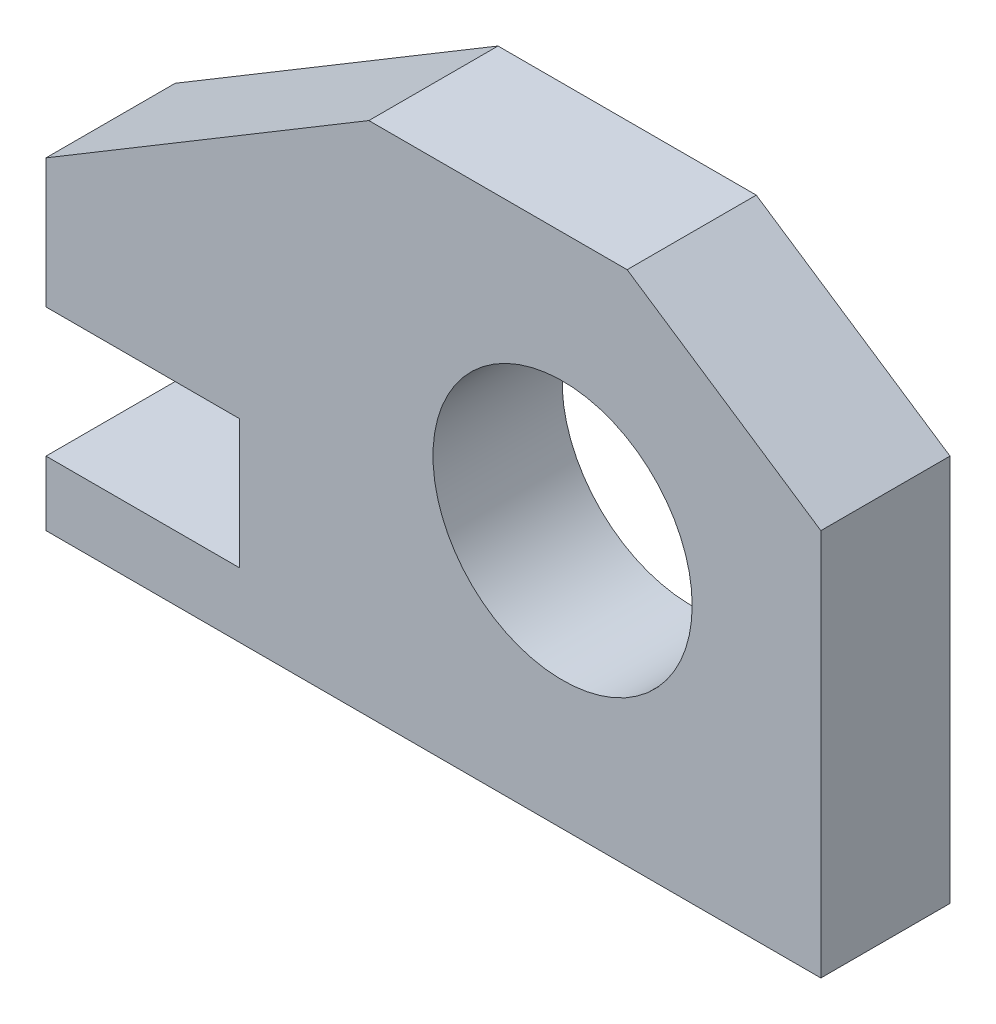
ISO-10303-21;
HEADER;
FILE_DESCRIPTION(('STEP AP214'),'2;1');
FILE_NAME('part.step','',(''),(''),'','','');
FILE_SCHEMA(('AUTOMOTIVE_DESIGN { 1 0 10303 214 1 1 1 1 }'));
ENDSEC;
DATA;
#1=APPLICATION_CONTEXT('core data for automotive mechanical design processes');
#2=APPLICATION_PROTOCOL_DEFINITION('international standard','automotive_design',2000,#1);
#3=PRODUCT_CONTEXT('',#1,'mechanical');
#4=PRODUCT('Part','Part','',(#3));
#5=PRODUCT_RELATED_PRODUCT_CATEGORY('part','',(#4));
#6=PRODUCT_DEFINITION_FORMATION('','',#4);
#7=PRODUCT_DEFINITION_CONTEXT('part definition',#1,'design');
#8=PRODUCT_DEFINITION('design','',#6,#7);
#9=PRODUCT_DEFINITION_SHAPE('','',#8);
#10=(LENGTH_UNIT() NAMED_UNIT(*) SI_UNIT(.MILLI.,.METRE.));
#11=(NAMED_UNIT(*) PLANE_ANGLE_UNIT() SI_UNIT($,.RADIAN.));
#12=(NAMED_UNIT(*) SI_UNIT($,.STERADIAN.) SOLID_ANGLE_UNIT());
#13=UNCERTAINTY_MEASURE_WITH_UNIT(LENGTH_MEASURE(1.E-05),#10,'distance_accuracy_value','');
#14=(GEOMETRIC_REPRESENTATION_CONTEXT(3) GLOBAL_UNCERTAINTY_ASSIGNED_CONTEXT((#13)) GLOBAL_UNIT_ASSIGNED_CONTEXT((#10,
#11,#12)) REPRESENTATION_CONTEXT('',''));
#15=CARTESIAN_POINT('',(0.,0.,0.));
#16=DIRECTION('',(0.,0.,1.));
#17=DIRECTION('',(1.,0.,0.));
#18=AXIS2_PLACEMENT_3D('',#15,#16,#17);
#19=CARTESIAN_POINT('',(-149.660784313726,43.3294117647059,12.7));
#20=DIRECTION('',(-0.514495755427526,0.857492925712544,0.));
#21=DIRECTION('',(-0.857492925712544,-0.514495755427526,0.));
#22=AXIS2_PLACEMENT_3D('',#19,#20,#21);
#23=PLANE('',#22);
#24=DIRECTION('',(0.857492925712544,0.514495755427526,0.));
#25=VECTOR('',#24,1.);
#26=CARTESIAN_POINT('',(-149.660784313726,43.3294117647059,0.));
#27=LINE('',#26,#25);
#28=CARTESIAN_POINT('',(-149.660784313726,43.3294117647059,0.));
#29=VERTEX_POINT('',#28);
#30=CARTESIAN_POINT('',(-117.910784313726,62.3794117647059,0.));
#31=VERTEX_POINT('',#30);
#32=EDGE_CURVE('E155',#29,#31,#27,.T.);
#33=ORIENTED_EDGE('',*,*,#32,.F.);
#34=DIRECTION('',(0.,0.,-1.));
#35=VECTOR('',#34,1.);
#36=CARTESIAN_POINT('',(-149.660784313726,43.3294117647059,12.7));
#37=LINE('',#36,#35);
#38=CARTESIAN_POINT('',(-149.660784313726,43.3294117647059,12.7));
#39=VERTEX_POINT('',#38);
#40=EDGE_CURVE('E11',#39,#29,#37,.T.);
#41=ORIENTED_EDGE('',*,*,#40,.F.);
#42=DIRECTION('',(0.857492925712544,0.514495755427526,0.));
#43=VECTOR('',#42,1.);
#44=CARTESIAN_POINT('',(-149.660784313726,43.3294117647059,12.7));
#45=LINE('',#44,#43);
#46=CARTESIAN_POINT('',(-117.910784313726,62.3794117647059,12.7));
#47=VERTEX_POINT('',#46);
#48=EDGE_CURVE('E191',#39,#47,#45,.T.);
#49=ORIENTED_EDGE('',*,*,#48,.T.);
#50=DIRECTION('',(0.,0.,-1.));
#51=VECTOR('',#50,1.);
#52=CARTESIAN_POINT('',(-117.910784313726,62.3794117647059,12.7));
#53=LINE('',#52,#51);
#54=EDGE_CURVE('E42',#47,#31,#53,.T.);
#55=ORIENTED_EDGE('',*,*,#54,.T.);
#56=EDGE_LOOP('',(#33,#41,#49,#55));
#57=FACE_BOUND('',#56,.T.);
#58=ADVANCED_FACE('F39',(#57),#23,.T.);
#59=CARTESIAN_POINT('',(-149.660784313726,43.3294117647059,12.7));
#60=DIRECTION('',(1.,0.,0.));
#61=DIRECTION('',(0.,0.,-1.));
#62=AXIS2_PLACEMENT_3D('',#59,#60,#61);
#63=PLANE('',#62);
#64=DIRECTION('',(0.,-1.,0.));
#65=VECTOR('',#64,1.);
#66=CARTESIAN_POINT('',(-149.660784313726,43.3294117647059,0.));
#67=LINE('',#66,#65);
#68=CARTESIAN_POINT('',(-149.660784313726,30.6294117647059,0.));
#69=VERTEX_POINT('',#68);
#70=EDGE_CURVE('E189',#29,#69,#67,.T.);
#71=ORIENTED_EDGE('',*,*,#70,.T.);
#72=DIRECTION('',(0.,0.,-1.));
#73=VECTOR('',#72,1.);
#74=CARTESIAN_POINT('',(-149.660784313726,30.6294117647059,12.7));
#75=LINE('',#74,#73);
#76=CARTESIAN_POINT('',(-149.660784313726,30.6294117647059,12.7));
#77=VERTEX_POINT('',#76);
#78=EDGE_CURVE('E49',#77,#69,#75,.T.);
#79=ORIENTED_EDGE('',*,*,#78,.F.);
#80=DIRECTION('',(0.,-1.,0.));
#81=VECTOR('',#80,1.);
#82=CARTESIAN_POINT('',(-149.660784313726,43.3294117647059,12.7));
#83=LINE('',#82,#81);
#84=EDGE_CURVE('E141',#39,#77,#83,.T.);
#85=ORIENTED_EDGE('',*,*,#84,.F.);
#86=ORIENTED_EDGE('',*,*,#40,.T.);
#87=EDGE_LOOP('',(#71,#79,#85,#86));
#88=FACE_BOUND('',#87,.T.);
#89=ADVANCED_FACE('F215',(#88),#63,.F.);
#90=CARTESIAN_POINT('',(-130.610784313726,30.6294117647059,12.7));
#91=DIRECTION('',(0.,-1.,0.));
#92=DIRECTION('',(0.,0.,-1.));
#93=AXIS2_PLACEMENT_3D('',#90,#91,#92);
#94=PLANE('',#93);
#95=DIRECTION('',(-1.,0.,0.));
#96=VECTOR('',#95,1.);
#97=CARTESIAN_POINT('',(-130.610784313726,30.6294117647059,0.));
#98=LINE('',#97,#96);
#99=CARTESIAN_POINT('',(-130.610784313726,30.6294117647059,0.));
#100=VERTEX_POINT('',#99);
#101=EDGE_CURVE('E126',#100,#69,#98,.T.);
#102=ORIENTED_EDGE('',*,*,#101,.F.);
#103=DIRECTION('',(0.,0.,-1.));
#104=VECTOR('',#103,1.);
#105=CARTESIAN_POINT('',(-130.610784313726,30.6294117647059,12.7));
#106=LINE('',#105,#104);
#107=CARTESIAN_POINT('',(-130.610784313726,30.6294117647059,12.7));
#108=VERTEX_POINT('',#107);
#109=EDGE_CURVE('E121',#108,#100,#106,.T.);
#110=ORIENTED_EDGE('',*,*,#109,.F.);
#111=DIRECTION('',(-1.,0.,0.));
#112=VECTOR('',#111,1.);
#113=CARTESIAN_POINT('',(-130.610784313726,30.6294117647059,12.7));
#114=LINE('',#113,#112);
#115=EDGE_CURVE('E124',#108,#77,#114,.T.);
#116=ORIENTED_EDGE('',*,*,#115,.T.);
#117=ORIENTED_EDGE('',*,*,#78,.T.);
#118=EDGE_LOOP('',(#102,#110,#116,#117));
#119=FACE_BOUND('',#118,.T.);
#120=ADVANCED_FACE('F123',(#119),#94,.T.);
#121=CARTESIAN_POINT('',(-130.610784313726,17.9294117647059,12.7));
#122=DIRECTION('',(-1.,0.,0.));
#123=DIRECTION('',(0.,0.,1.));
#124=AXIS2_PLACEMENT_3D('',#121,#122,#123);
#125=PLANE('',#124);
#126=DIRECTION('',(0.,1.,0.));
#127=VECTOR('',#126,1.);
#128=CARTESIAN_POINT('',(-130.610784313726,17.9294117647059,0.));
#129=LINE('',#128,#127);
#130=CARTESIAN_POINT('',(-130.610784313726,17.9294117647059,0.));
#131=VERTEX_POINT('',#130);
#132=EDGE_CURVE('E184',#131,#100,#129,.T.);
#133=ORIENTED_EDGE('',*,*,#132,.F.);
#134=DIRECTION('',(0.,0.,-1.));
#135=VECTOR('',#134,1.);
#136=CARTESIAN_POINT('',(-130.610784313726,17.9294117647059,12.7));
#137=LINE('',#136,#135);
#138=CARTESIAN_POINT('',(-130.610784313726,17.9294117647059,12.7));
#139=VERTEX_POINT('',#138);
#140=EDGE_CURVE('E132',#139,#131,#137,.T.);
#141=ORIENTED_EDGE('',*,*,#140,.F.);
#142=DIRECTION('',(0.,1.,0.));
#143=VECTOR('',#142,1.);
#144=CARTESIAN_POINT('',(-130.610784313726,17.9294117647059,12.7));
#145=LINE('',#144,#143);
#146=EDGE_CURVE('E139',#139,#108,#145,.T.);
#147=ORIENTED_EDGE('',*,*,#146,.T.);
#148=ORIENTED_EDGE('',*,*,#109,.T.);
#149=EDGE_LOOP('',(#133,#141,#147,#148));
#150=FACE_BOUND('',#149,.T.);
#151=ADVANCED_FACE('F144',(#150),#125,.T.);
#152=CARTESIAN_POINT('',(-149.660784313726,17.9294117647059,12.7));
#153=DIRECTION('',(0.,1.,0.));
#154=DIRECTION('',(0.,0.,1.));
#155=AXIS2_PLACEMENT_3D('',#152,#153,#154);
#156=PLANE('',#155);
#157=DIRECTION('',(1.,0.,0.));
#158=VECTOR('',#157,1.);
#159=CARTESIAN_POINT('',(-149.660784313726,17.9294117647059,0.));
#160=LINE('',#159,#158);
#161=CARTESIAN_POINT('',(-149.660784313726,17.9294117647059,0.));
#162=VERTEX_POINT('',#161);
#163=EDGE_CURVE('E180',#162,#131,#160,.T.);
#164=ORIENTED_EDGE('',*,*,#163,.F.);
#165=DIRECTION('',(0.,0.,-1.));
#166=VECTOR('',#165,1.);
#167=CARTESIAN_POINT('',(-149.660784313726,17.9294117647059,12.7));
#168=LINE('',#167,#166);
#169=CARTESIAN_POINT('',(-149.660784313726,17.9294117647059,12.7));
#170=VERTEX_POINT('',#169);
#171=EDGE_CURVE('E197',#170,#162,#168,.T.);
#172=ORIENTED_EDGE('',*,*,#171,.F.);
#173=DIRECTION('',(1.,0.,0.));
#174=VECTOR('',#173,1.);
#175=CARTESIAN_POINT('',(-149.660784313726,17.9294117647059,12.7));
#176=LINE('',#175,#174);
#177=EDGE_CURVE('E146',#170,#139,#176,.T.);
#178=ORIENTED_EDGE('',*,*,#177,.T.);
#179=ORIENTED_EDGE('',*,*,#140,.T.);
#180=EDGE_LOOP('',(#164,#172,#178,#179));
#181=FACE_BOUND('',#180,.T.);
#182=ADVANCED_FACE('F255',(#181),#156,.T.);
#183=CARTESIAN_POINT('',(-149.660784313726,11.5794117647059,12.7));
#184=DIRECTION('',(-1.,0.,0.));
#185=DIRECTION('',(0.,0.,1.));
#186=AXIS2_PLACEMENT_3D('',#183,#184,#185);
#187=PLANE('',#186);
#188=DIRECTION('',(0.,1.,0.));
#189=VECTOR('',#188,1.);
#190=CARTESIAN_POINT('',(-149.660784313726,11.5794117647059,0.));
#191=LINE('',#190,#189);
#192=CARTESIAN_POINT('',(-149.660784313726,11.5794117647059,0.));
#193=VERTEX_POINT('',#192);
#194=EDGE_CURVE('E176',#193,#162,#191,.T.);
#195=ORIENTED_EDGE('',*,*,#194,.F.);
#196=DIRECTION('',(0.,0.,-1.));
#197=VECTOR('',#196,1.);
#198=CARTESIAN_POINT('',(-149.660784313726,11.5794117647059,12.7));
#199=LINE('',#198,#197);
#200=CARTESIAN_POINT('',(-149.660784313726,11.5794117647059,12.7));
#201=VERTEX_POINT('',#200);
#202=EDGE_CURVE('E200',#201,#193,#199,.T.);
#203=ORIENTED_EDGE('',*,*,#202,.F.);
#204=DIRECTION('',(0.,1.,0.));
#205=VECTOR('',#204,1.);
#206=CARTESIAN_POINT('',(-149.660784313726,11.5794117647059,12.7));
#207=LINE('',#206,#205);
#208=EDGE_CURVE('E149',#201,#170,#207,.T.);
#209=ORIENTED_EDGE('',*,*,#208,.T.);
#210=ORIENTED_EDGE('',*,*,#171,.T.);
#211=EDGE_LOOP('',(#195,#203,#209,#210));
#212=FACE_BOUND('',#211,.T.);
#213=ADVANCED_FACE('F242',(#212),#187,.T.);
#214=CARTESIAN_POINT('',(-73.4607843137255,11.5794117647059,12.7));
#215=DIRECTION('',(0.,-1.,0.));
#216=DIRECTION('',(1.,0.,0.));
#217=AXIS2_PLACEMENT_3D('',#214,#215,#216);
#218=PLANE('',#217);
#219=DIRECTION('',(-1.,0.,0.));
#220=VECTOR('',#219,1.);
#221=CARTESIAN_POINT('',(-73.4607843137255,11.5794117647059,0.));
#222=LINE('',#221,#220);
#223=CARTESIAN_POINT('',(-73.4607843137255,11.5794117647059,0.));
#224=VERTEX_POINT('',#223);
#225=EDGE_CURVE('E172',#224,#193,#222,.T.);
#226=ORIENTED_EDGE('',*,*,#225,.F.);
#227=DIRECTION('',(0.,0.,-1.));
#228=VECTOR('',#227,1.);
#229=CARTESIAN_POINT('',(-73.4607843137255,11.5794117647059,12.7));
#230=LINE('',#229,#228);
#231=CARTESIAN_POINT('',(-73.4607843137255,11.5794117647059,12.7));
#232=VERTEX_POINT('',#231);
#233=EDGE_CURVE('E203',#232,#224,#230,.T.);
#234=ORIENTED_EDGE('',*,*,#233,.F.);
#235=DIRECTION('',(-1.,0.,0.));
#236=VECTOR('',#235,1.);
#237=CARTESIAN_POINT('',(-73.4607843137255,11.5794117647059,12.7));
#238=LINE('',#237,#236);
#239=EDGE_CURVE('E234',#232,#201,#238,.T.);
#240=ORIENTED_EDGE('',*,*,#239,.T.);
#241=ORIENTED_EDGE('',*,*,#202,.T.);
#242=EDGE_LOOP('',(#226,#234,#240,#241));
#243=FACE_BOUND('',#242,.T.);
#244=ADVANCED_FACE('F248',(#243),#218,.T.);
#245=CARTESIAN_POINT('',(-73.4607843137255,49.6794117647059,12.7));
#246=DIRECTION('',(1.,0.,0.));
#247=DIRECTION('',(0.,1.,0.));
#248=AXIS2_PLACEMENT_3D('',#245,#246,#247);
#249=PLANE('',#248);
#250=DIRECTION('',(0.,-1.,0.));
#251=VECTOR('',#250,1.);
#252=CARTESIAN_POINT('',(-73.4607843137255,49.6794117647059,0.));
#253=LINE('',#252,#251);
#254=CARTESIAN_POINT('',(-73.4607843137255,49.6794117647059,0.));
#255=VERTEX_POINT('',#254);
#256=EDGE_CURVE('E168',#255,#224,#253,.T.);
#257=ORIENTED_EDGE('',*,*,#256,.F.);
#258=DIRECTION('',(0.,0.,-1.));
#259=VECTOR('',#258,1.);
#260=CARTESIAN_POINT('',(-73.4607843137255,49.6794117647059,12.7));
#261=LINE('',#260,#259);
#262=CARTESIAN_POINT('',(-73.4607843137255,49.6794117647059,12.7));
#263=VERTEX_POINT('',#262);
#264=EDGE_CURVE('E206',#263,#255,#261,.T.);
#265=ORIENTED_EDGE('',*,*,#264,.F.);
#266=DIRECTION('',(0.,-1.,0.));
#267=VECTOR('',#266,1.);
#268=CARTESIAN_POINT('',(-73.4607843137255,49.6794117647059,12.7));
#269=LINE('',#268,#267);
#270=EDGE_CURVE('E230',#263,#232,#269,.T.);
#271=ORIENTED_EDGE('',*,*,#270,.T.);
#272=ORIENTED_EDGE('',*,*,#233,.T.);
#273=EDGE_LOOP('',(#257,#265,#271,#272));
#274=FACE_BOUND('',#273,.T.);
#275=ADVANCED_FACE('F251',(#274),#249,.T.);
#276=CARTESIAN_POINT('',(-92.5107843137255,62.3794117647059,12.7));
#277=DIRECTION('',(0.554700196225229,0.832050294337844,0.));
#278=DIRECTION('',(-0.832050294337844,0.554700196225229,0.));
#279=AXIS2_PLACEMENT_3D('',#276,#277,#278);
#280=PLANE('',#279);
#281=DIRECTION('',(0.832050294337844,-0.554700196225229,0.));
#282=VECTOR('',#281,1.);
#283=CARTESIAN_POINT('',(-92.5107843137255,62.3794117647059,0.));
#284=LINE('',#283,#282);
#285=CARTESIAN_POINT('',(-92.5107843137255,62.3794117647059,0.));
#286=VERTEX_POINT('',#285);
#287=EDGE_CURVE('E164',#286,#255,#284,.T.);
#288=ORIENTED_EDGE('',*,*,#287,.F.);
#289=DIRECTION('',(0.,0.,-1.));
#290=VECTOR('',#289,1.);
#291=CARTESIAN_POINT('',(-92.5107843137255,62.3794117647059,12.7));
#292=LINE('',#291,#290);
#293=CARTESIAN_POINT('',(-92.5107843137255,62.3794117647059,12.7));
#294=VERTEX_POINT('',#293);
#295=EDGE_CURVE('E208',#294,#286,#292,.T.);
#296=ORIENTED_EDGE('',*,*,#295,.F.);
#297=DIRECTION('',(0.832050294337844,-0.554700196225229,0.));
#298=VECTOR('',#297,1.);
#299=CARTESIAN_POINT('',(-92.5107843137255,62.3794117647059,12.7));
#300=LINE('',#299,#298);
#301=EDGE_CURVE('E221',#294,#263,#300,.T.);
#302=ORIENTED_EDGE('',*,*,#301,.T.);
#303=ORIENTED_EDGE('',*,*,#264,.T.);
#304=EDGE_LOOP('',(#288,#296,#302,#303));
#305=FACE_BOUND('',#304,.T.);
#306=ADVANCED_FACE('F253',(#305),#280,.T.);
#307=CARTESIAN_POINT('',(-117.910784313726,62.3794117647059,12.7));
#308=DIRECTION('',(0.,1.,0.));
#309=DIRECTION('',(0.,0.,1.));
#310=AXIS2_PLACEMENT_3D('',#307,#308,#309);
#311=PLANE('',#310);
#312=DIRECTION('',(1.,0.,0.));
#313=VECTOR('',#312,1.);
#314=CARTESIAN_POINT('',(-117.910784313726,62.3794117647059,0.));
#315=LINE('',#314,#313);
#316=EDGE_CURVE('E159',#31,#286,#315,.T.);
#317=ORIENTED_EDGE('',*,*,#316,.F.);
#318=ORIENTED_EDGE('',*,*,#54,.F.);
#319=DIRECTION('',(1.,0.,0.));
#320=VECTOR('',#319,1.);
#321=CARTESIAN_POINT('',(-117.910784313726,62.3794117647059,12.7));
#322=LINE('',#321,#320);
#323=EDGE_CURVE('E217',#47,#294,#322,.T.);
#324=ORIENTED_EDGE('',*,*,#323,.T.);
#325=ORIENTED_EDGE('',*,*,#295,.T.);
#326=EDGE_LOOP('',(#317,#318,#324,#325));
#327=FACE_BOUND('',#326,.T.);
#328=ADVANCED_FACE('F212',(#327),#311,.T.);
#329=CARTESIAN_POINT('',(0.,0.,12.7));
#330=DIRECTION('',(0.,0.,-1.));
#331=DIRECTION('',(-1.,0.,0.));
#332=AXIS2_PLACEMENT_3D('',#329,#330,#331);
#333=PLANE('',#332);
#334=CARTESIAN_POINT('',(-98.8607843137255,36.9794117647059,12.7));
#335=DIRECTION('',(0.,0.,1.));
#336=DIRECTION('',(1.,0.,0.));
#337=AXIS2_PLACEMENT_3D('',#334,#335,#336);
#338=CIRCLE('',#337,12.7458153357434);
#339=CARTESIAN_POINT('',(-86.1149689779822,36.9794117647059,12.7));
#340=VERTEX_POINT('',#339);
#341=EDGE_CURVE('E224',#340,#340,#338,.T.);
#342=ORIENTED_EDGE('',*,*,#341,.F.);
#343=EDGE_LOOP('',(#342));
#344=FACE_BOUND('',#343,.T.);
#345=ORIENTED_EDGE('',*,*,#48,.F.);
#346=ORIENTED_EDGE('',*,*,#84,.T.);
#347=ORIENTED_EDGE('',*,*,#115,.F.);
#348=ORIENTED_EDGE('',*,*,#146,.F.);
#349=ORIENTED_EDGE('',*,*,#177,.F.);
#350=ORIENTED_EDGE('',*,*,#208,.F.);
#351=ORIENTED_EDGE('',*,*,#239,.F.);
#352=ORIENTED_EDGE('',*,*,#270,.F.);
#353=ORIENTED_EDGE('',*,*,#301,.F.);
#354=ORIENTED_EDGE('',*,*,#323,.F.);
#355=EDGE_LOOP('',(#345,#346,#347,#348,#349,#350,#351,#352,#353,#354));
#356=FACE_BOUND('',#355,.T.);
#357=ADVANCED_FACE('F137',(#344,#356),#333,.F.);
#358=CARTESIAN_POINT('',(0.,0.,0.));
#359=DIRECTION('',(0.,0.,-1.));
#360=DIRECTION('',(-1.,0.,0.));
#361=AXIS2_PLACEMENT_3D('',#358,#359,#360);
#362=PLANE('',#361);
#363=CARTESIAN_POINT('',(-98.8607843137255,36.9794117647059,0.));
#364=DIRECTION('',(0.,0.,1.));
#365=DIRECTION('',(1.,0.,0.));
#366=AXIS2_PLACEMENT_3D('',#363,#364,#365);
#367=CIRCLE('',#366,12.7458153357434);
#368=CARTESIAN_POINT('',(-86.1149689779822,36.9794117647059,0.));
#369=VERTEX_POINT('',#368);
#370=EDGE_CURVE('E160',#369,#369,#367,.T.);
#371=ORIENTED_EDGE('',*,*,#370,.T.);
#372=EDGE_LOOP('',(#371));
#373=FACE_BOUND('',#372,.T.);
#374=ORIENTED_EDGE('',*,*,#32,.T.);
#375=ORIENTED_EDGE('',*,*,#316,.T.);
#376=ORIENTED_EDGE('',*,*,#287,.T.);
#377=ORIENTED_EDGE('',*,*,#256,.T.);
#378=ORIENTED_EDGE('',*,*,#225,.T.);
#379=ORIENTED_EDGE('',*,*,#194,.T.);
#380=ORIENTED_EDGE('',*,*,#163,.T.);
#381=ORIENTED_EDGE('',*,*,#132,.T.);
#382=ORIENTED_EDGE('',*,*,#101,.T.);
#383=ORIENTED_EDGE('',*,*,#70,.F.);
#384=EDGE_LOOP('',(#374,#375,#376,#377,#378,#379,#380,#381,#382,#383));
#385=FACE_BOUND('',#384,.T.);
#386=ADVANCED_FACE('F214',(#373,#385),#362,.T.);
#387=CARTESIAN_POINT('',(-98.8607843137255,36.9794117647059,0.));
#388=DIRECTION('',(0.,0.,1.));
#389=DIRECTION('',(1.,0.,0.));
#390=AXIS2_PLACEMENT_3D('',#387,#388,#389);
#391=CYLINDRICAL_SURFACE('',#390,12.7458153357434);
#392=ORIENTED_EDGE('',*,*,#370,.F.);
#393=EDGE_LOOP('',(#392));
#394=FACE_BOUND('',#393,.T.);
#395=ORIENTED_EDGE('',*,*,#341,.T.);
#396=EDGE_LOOP('',(#395));
#397=FACE_BOUND('',#396,.T.);
#398=ADVANCED_FACE('F276',(#394,#397),#391,.F.);
#399=CLOSED_SHELL('',(#58,#89,#120,#151,#182,#213,#244,#275,#306,#328,#357,#386,#398));
#400=MANIFOLD_SOLID_BREP('B2',#399);
#401=ADVANCED_BREP_SHAPE_REPRESENTATION('',(#18,#400),#14);
#402=SHAPE_DEFINITION_REPRESENTATION(#9,#401);
ENDSEC;
END-ISO-10303-21;
